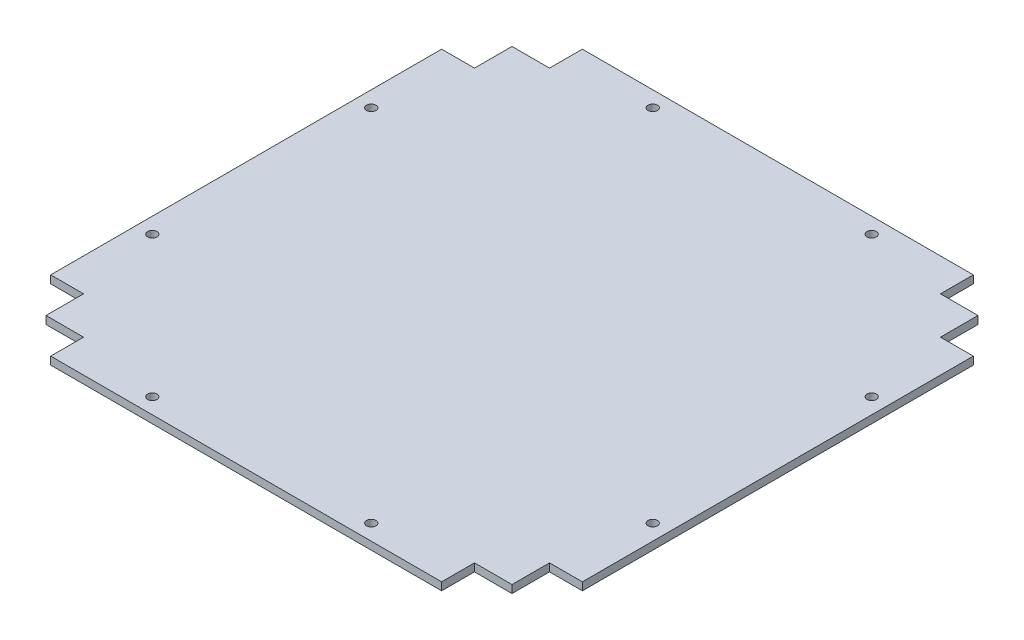
ISO-10303-21;
HEADER;
FILE_DESCRIPTION(('STEP AP214'),'2;1');
FILE_NAME('part.step','',(''),(''),'','','');
FILE_SCHEMA(('AUTOMOTIVE_DESIGN { 1 0 10303 214 1 1 1 1 }'));
ENDSEC;
DATA;
#1=APPLICATION_CONTEXT('core data for automotive mechanical design processes');
#2=APPLICATION_PROTOCOL_DEFINITION('international standard','automotive_design',2000,#1);
#3=PRODUCT_CONTEXT('',#1,'mechanical');
#4=PRODUCT('Part','Part','',(#3));
#5=PRODUCT_RELATED_PRODUCT_CATEGORY('part','',(#4));
#6=PRODUCT_DEFINITION_FORMATION('','',#4);
#7=PRODUCT_DEFINITION_CONTEXT('part definition',#1,'design');
#8=PRODUCT_DEFINITION('design','',#6,#7);
#9=PRODUCT_DEFINITION_SHAPE('','',#8);
#10=(LENGTH_UNIT() NAMED_UNIT(*) SI_UNIT(.MILLI.,.METRE.));
#11=(NAMED_UNIT(*) PLANE_ANGLE_UNIT() SI_UNIT($,.RADIAN.));
#12=(NAMED_UNIT(*) SI_UNIT($,.STERADIAN.) SOLID_ANGLE_UNIT());
#13=UNCERTAINTY_MEASURE_WITH_UNIT(LENGTH_MEASURE(1.E-05),#10,'distance_accuracy_value','');
#14=(GEOMETRIC_REPRESENTATION_CONTEXT(3) GLOBAL_UNCERTAINTY_ASSIGNED_CONTEXT((#13)) GLOBAL_UNIT_ASSIGNED_CONTEXT((#10,
#11,#12)) REPRESENTATION_CONTEXT('',''));
#15=CARTESIAN_POINT('',(0.,0.,0.));
#16=DIRECTION('',(0.,0.,1.));
#17=DIRECTION('',(1.,0.,0.));
#18=AXIS2_PLACEMENT_3D('',#15,#16,#17);
#19=CARTESIAN_POINT('',(0.,5.,0.));
#20=DIRECTION('',(0.,1.,0.));
#21=DIRECTION('',(0.,0.,1.));
#22=AXIS2_PLACEMENT_3D('',#19,#20,#21);
#23=PLANE('',#22);
#24=CARTESIAN_POINT('',(240.,5.,10.));
#25=DIRECTION('',(0.,1.,0.));
#26=DIRECTION('',(0.,0.,1.));
#27=AXIS2_PLACEMENT_3D('',#24,#25,#26);
#28=CIRCLE('',#27,2.99999999999999);
#29=CARTESIAN_POINT('',(240.,5.,13.));
#30=VERTEX_POINT('',#29);
#31=EDGE_CURVE('E371',#30,#30,#28,.F.);
#32=ORIENTED_EDGE('',*,*,#31,.T.);
#33=EDGE_LOOP('',(#32));
#34=FACE_BOUND('',#33,.T.);
#35=CARTESIAN_POINT('',(330.,5.,240.));
#36=DIRECTION('',(0.,1.,0.));
#37=DIRECTION('',(0.,0.,1.));
#38=AXIS2_PLACEMENT_3D('',#35,#36,#37);
#39=CIRCLE('',#38,2.99999999999997);
#40=CARTESIAN_POINT('',(330.,5.,243.));
#41=VERTEX_POINT('',#40);
#42=EDGE_CURVE('E366',#41,#41,#39,.F.);
#43=ORIENTED_EDGE('',*,*,#42,.T.);
#44=EDGE_LOOP('',(#43));
#45=FACE_BOUND('',#44,.T.);
#46=CARTESIAN_POINT('',(330.,5.,100.));
#47=DIRECTION('',(0.,1.,0.));
#48=DIRECTION('',(0.,0.,1.));
#49=AXIS2_PLACEMENT_3D('',#46,#47,#48);
#50=CIRCLE('',#49,3.00000000000002);
#51=CARTESIAN_POINT('',(330.,5.,103.));
#52=VERTEX_POINT('',#51);
#53=EDGE_CURVE('E361',#52,#52,#50,.F.);
#54=ORIENTED_EDGE('',*,*,#53,.T.);
#55=EDGE_LOOP('',(#54));
#56=FACE_BOUND('',#55,.T.);
#57=CARTESIAN_POINT('',(100.,5.,10.));
#58=DIRECTION('',(0.,1.,0.));
#59=DIRECTION('',(0.,0.,1.));
#60=AXIS2_PLACEMENT_3D('',#57,#58,#59);
#61=CIRCLE('',#60,3.00000000000001);
#62=CARTESIAN_POINT('',(100.,5.,13.));
#63=VERTEX_POINT('',#62);
#64=EDGE_CURVE('E351',#63,#63,#61,.F.);
#65=ORIENTED_EDGE('',*,*,#64,.T.);
#66=EDGE_LOOP('',(#65));
#67=FACE_BOUND('',#66,.T.);
#68=DIRECTION('',(0.,0.,1.));
#69=VECTOR('',#68,1.);
#70=CARTESIAN_POINT('',(45.,5.,319.));
#71=LINE('',#70,#69);
#72=CARTESIAN_POINT('',(45.,5.,319.));
#73=VERTEX_POINT('',#72);
#74=CARTESIAN_POINT('',(45.,5.,340.));
#75=VERTEX_POINT('',#74);
#76=EDGE_CURVE('E281',#73,#75,#71,.T.);
#77=ORIENTED_EDGE('',*,*,#76,.T.);
#78=DIRECTION('',(1.,0.,0.));
#79=VECTOR('',#78,1.);
#80=CARTESIAN_POINT('',(45.,5.,340.));
#81=LINE('',#80,#79);
#82=CARTESIAN_POINT('',(295.,5.,340.));
#83=VERTEX_POINT('',#82);
#84=EDGE_CURVE('E145',#75,#83,#81,.T.);
#85=ORIENTED_EDGE('',*,*,#84,.T.);
#86=DIRECTION('',(0.,0.,-1.));
#87=VECTOR('',#86,1.);
#88=CARTESIAN_POINT('',(295.,5.,319.));
#89=LINE('',#88,#87);
#90=CARTESIAN_POINT('',(295.,5.,319.));
#91=VERTEX_POINT('',#90);
#92=EDGE_CURVE('E400',#83,#91,#89,.T.);
#93=ORIENTED_EDGE('',*,*,#92,.T.);
#94=DIRECTION('',(1.,0.,0.));
#95=VECTOR('',#94,1.);
#96=CARTESIAN_POINT('',(319.,5.,319.));
#97=LINE('',#96,#95);
#98=CARTESIAN_POINT('',(319.,5.,319.));
#99=VERTEX_POINT('',#98);
#100=EDGE_CURVE('E403',#91,#99,#97,.T.);
#101=ORIENTED_EDGE('',*,*,#100,.T.);
#102=DIRECTION('',(0.,0.,-1.));
#103=VECTOR('',#102,1.);
#104=CARTESIAN_POINT('',(319.,5.,295.));
#105=LINE('',#104,#103);
#106=CARTESIAN_POINT('',(319.,5.,295.));
#107=VERTEX_POINT('',#106);
#108=EDGE_CURVE('E406',#99,#107,#105,.T.);
#109=ORIENTED_EDGE('',*,*,#108,.T.);
#110=DIRECTION('',(1.,0.,0.));
#111=VECTOR('',#110,1.);
#112=CARTESIAN_POINT('',(340.,5.,295.));
#113=LINE('',#112,#111);
#114=CARTESIAN_POINT('',(340.,5.,295.));
#115=VERTEX_POINT('',#114);
#116=EDGE_CURVE('E409',#107,#115,#113,.T.);
#117=ORIENTED_EDGE('',*,*,#116,.T.);
#118=DIRECTION('',(0.,0.,-1.));
#119=VECTOR('',#118,1.);
#120=CARTESIAN_POINT('',(340.,5.,45.0000000000002));
#121=LINE('',#120,#119);
#122=CARTESIAN_POINT('',(340.,5.,45.0000000000002));
#123=VERTEX_POINT('',#122);
#124=EDGE_CURVE('E412',#115,#123,#121,.T.);
#125=ORIENTED_EDGE('',*,*,#124,.T.);
#126=DIRECTION('',(-1.,0.,0.));
#127=VECTOR('',#126,1.);
#128=CARTESIAN_POINT('',(340.,5.,45.0000000000002));
#129=LINE('',#128,#127);
#130=CARTESIAN_POINT('',(319.,5.,45.0000000000002));
#131=VERTEX_POINT('',#130);
#132=EDGE_CURVE('E415',#123,#131,#129,.T.);
#133=ORIENTED_EDGE('',*,*,#132,.T.);
#134=DIRECTION('',(0.,0.,-1.));
#135=VECTOR('',#134,1.);
#136=CARTESIAN_POINT('',(319.,5.,45.0000000000002));
#137=LINE('',#136,#135);
#138=CARTESIAN_POINT('',(319.,5.,21.0000000000002));
#139=VERTEX_POINT('',#138);
#140=EDGE_CURVE('E418',#131,#139,#137,.T.);
#141=ORIENTED_EDGE('',*,*,#140,.T.);
#142=DIRECTION('',(-1.,0.,0.));
#143=VECTOR('',#142,1.);
#144=CARTESIAN_POINT('',(319.,5.,21.0000000000002));
#145=LINE('',#144,#143);
#146=CARTESIAN_POINT('',(295.,5.,21.0000000000002));
#147=VERTEX_POINT('',#146);
#148=EDGE_CURVE('E421',#139,#147,#145,.T.);
#149=ORIENTED_EDGE('',*,*,#148,.T.);
#150=DIRECTION('',(0.,0.,-1.));
#151=VECTOR('',#150,1.);
#152=CARTESIAN_POINT('',(295.,5.,21.0000000000002));
#153=LINE('',#152,#151);
#154=CARTESIAN_POINT('',(295.,5.,2.22044604925031E-13));
#155=VERTEX_POINT('',#154);
#156=EDGE_CURVE('E424',#147,#155,#153,.T.);
#157=ORIENTED_EDGE('',*,*,#156,.T.);
#158=DIRECTION('',(-1.,0.,0.));
#159=VECTOR('',#158,1.);
#160=CARTESIAN_POINT('',(45.,5.,0.));
#161=LINE('',#160,#159);
#162=CARTESIAN_POINT('',(45.,5.,0.));
#163=VERTEX_POINT('',#162);
#164=EDGE_CURVE('E427',#155,#163,#161,.T.);
#165=ORIENTED_EDGE('',*,*,#164,.T.);
#166=DIRECTION('',(0.,0.,1.));
#167=VECTOR('',#166,1.);
#168=CARTESIAN_POINT('',(45.,5.,21.));
#169=LINE('',#168,#167);
#170=CARTESIAN_POINT('',(45.,5.,21.));
#171=VERTEX_POINT('',#170);
#172=EDGE_CURVE('E430',#163,#171,#169,.T.);
#173=ORIENTED_EDGE('',*,*,#172,.T.);
#174=DIRECTION('',(-1.,0.,0.));
#175=VECTOR('',#174,1.);
#176=CARTESIAN_POINT('',(21.,5.,21.));
#177=LINE('',#176,#175);
#178=CARTESIAN_POINT('',(21.,5.,21.));
#179=VERTEX_POINT('',#178);
#180=EDGE_CURVE('E433',#171,#179,#177,.T.);
#181=ORIENTED_EDGE('',*,*,#180,.T.);
#182=DIRECTION('',(0.,0.,1.));
#183=VECTOR('',#182,1.);
#184=CARTESIAN_POINT('',(21.,5.,45.));
#185=LINE('',#184,#183);
#186=CARTESIAN_POINT('',(21.,5.,45.));
#187=VERTEX_POINT('',#186);
#188=EDGE_CURVE('E436',#179,#187,#185,.T.);
#189=ORIENTED_EDGE('',*,*,#188,.T.);
#190=DIRECTION('',(-1.,0.,0.));
#191=VECTOR('',#190,1.);
#192=CARTESIAN_POINT('',(0.,5.,45.));
#193=LINE('',#192,#191);
#194=CARTESIAN_POINT('',(0.,5.,45.));
#195=VERTEX_POINT('',#194);
#196=EDGE_CURVE('E439',#187,#195,#193,.T.);
#197=ORIENTED_EDGE('',*,*,#196,.T.);
#198=DIRECTION('',(0.,0.,1.));
#199=VECTOR('',#198,1.);
#200=CARTESIAN_POINT('',(0.,5.,45.));
#201=LINE('',#200,#199);
#202=CARTESIAN_POINT('',(0.,5.,295.));
#203=VERTEX_POINT('',#202);
#204=EDGE_CURVE('E200',#195,#203,#201,.T.);
#205=ORIENTED_EDGE('',*,*,#204,.T.);
#206=DIRECTION('',(1.,0.,0.));
#207=VECTOR('',#206,1.);
#208=CARTESIAN_POINT('',(0.,5.,295.));
#209=LINE('',#208,#207);
#210=CARTESIAN_POINT('',(21.,5.,295.));
#211=VERTEX_POINT('',#210);
#212=EDGE_CURVE('E194',#203,#211,#209,.T.);
#213=ORIENTED_EDGE('',*,*,#212,.T.);
#214=DIRECTION('',(0.,0.,1.));
#215=VECTOR('',#214,1.);
#216=CARTESIAN_POINT('',(21.,5.,295.));
#217=LINE('',#216,#215);
#218=CARTESIAN_POINT('',(21.,5.,319.));
#219=VERTEX_POINT('',#218);
#220=EDGE_CURVE('E198',#211,#219,#217,.T.);
#221=ORIENTED_EDGE('',*,*,#220,.T.);
#222=DIRECTION('',(1.,0.,0.));
#223=VECTOR('',#222,1.);
#224=CARTESIAN_POINT('',(21.,5.,319.));
#225=LINE('',#224,#223);
#226=EDGE_CURVE('E66',#219,#73,#225,.T.);
#227=ORIENTED_EDGE('',*,*,#226,.T.);
#228=EDGE_LOOP('',(#77,#85,#93,#101,#109,#117,#125,#133,#141,#149,#157,#165,#173,#181,#189,#197,
#205,#213,#221,#227));
#229=FACE_BOUND('',#228,.T.);
#230=CARTESIAN_POINT('',(240.,5.,330.));
#231=DIRECTION('',(0.,1.,0.));
#232=DIRECTION('',(0.,0.,1.));
#233=AXIS2_PLACEMENT_3D('',#230,#231,#232);
#234=CIRCLE('',#233,2.99999999999999);
#235=CARTESIAN_POINT('',(240.,5.,333.));
#236=VERTEX_POINT('',#235);
#237=EDGE_CURVE('E356',#236,#236,#234,.T.);
#238=ORIENTED_EDGE('',*,*,#237,.F.);
#239=EDGE_LOOP('',(#238));
#240=FACE_BOUND('',#239,.T.);
#241=CARTESIAN_POINT('',(100.,5.,330.));
#242=DIRECTION('',(0.,1.,0.));
#243=DIRECTION('',(0.,0.,1.));
#244=AXIS2_PLACEMENT_3D('',#241,#242,#243);
#245=CIRCLE('',#244,3.00000000000001);
#246=CARTESIAN_POINT('',(100.,5.,333.));
#247=VERTEX_POINT('',#246);
#248=EDGE_CURVE('E375',#247,#247,#245,.T.);
#249=ORIENTED_EDGE('',*,*,#248,.F.);
#250=EDGE_LOOP('',(#249));
#251=FACE_BOUND('',#250,.T.);
#252=CARTESIAN_POINT('',(10.0000000000001,5.,240.));
#253=DIRECTION('',(0.,1.,0.));
#254=DIRECTION('',(0.,0.,1.));
#255=AXIS2_PLACEMENT_3D('',#252,#253,#254);
#256=CIRCLE('',#255,2.99999999999998);
#257=CARTESIAN_POINT('',(10.0000000000001,5.,243.));
#258=VERTEX_POINT('',#257);
#259=EDGE_CURVE('E379',#258,#258,#256,.T.);
#260=ORIENTED_EDGE('',*,*,#259,.F.);
#261=EDGE_LOOP('',(#260));
#262=FACE_BOUND('',#261,.T.);
#263=CARTESIAN_POINT('',(10.,5.,100.));
#264=DIRECTION('',(0.,1.,0.));
#265=DIRECTION('',(0.,0.,1.));
#266=AXIS2_PLACEMENT_3D('',#263,#264,#265);
#267=CIRCLE('',#266,3.00000000000002);
#268=CARTESIAN_POINT('',(10.,5.,103.));
#269=VERTEX_POINT('',#268);
#270=EDGE_CURVE('E227',#269,#269,#267,.T.);
#271=ORIENTED_EDGE('',*,*,#270,.F.);
#272=EDGE_LOOP('',(#271));
#273=FACE_BOUND('',#272,.T.);
#274=ADVANCED_FACE('F46',(#34,#45,#56,#67,#229,#240,#251,#262,#273),#23,.T.);
#275=CARTESIAN_POINT('',(0.,0.,0.));
#276=DIRECTION('',(0.,1.,0.));
#277=DIRECTION('',(0.,0.,1.));
#278=AXIS2_PLACEMENT_3D('',#275,#276,#277);
#279=PLANE('',#278);
#280=CARTESIAN_POINT('',(10.0000000000001,0.,240.));
#281=DIRECTION('',(0.,1.,0.));
#282=DIRECTION('',(0.,0.,1.));
#283=AXIS2_PLACEMENT_3D('',#280,#281,#282);
#284=CIRCLE('',#283,2.99999999999998);
#285=CARTESIAN_POINT('',(10.0000000000001,0.,243.));
#286=VERTEX_POINT('',#285);
#287=EDGE_CURVE('E376',#286,#286,#284,.T.);
#288=ORIENTED_EDGE('',*,*,#287,.T.);
#289=EDGE_LOOP('',(#288));
#290=FACE_BOUND('',#289,.T.);
#291=CARTESIAN_POINT('',(240.,0.,330.));
#292=DIRECTION('',(0.,1.,0.));
#293=DIRECTION('',(0.,0.,1.));
#294=AXIS2_PLACEMENT_3D('',#291,#292,#293);
#295=CIRCLE('',#294,2.99999999999999);
#296=CARTESIAN_POINT('',(240.,0.,333.));
#297=VERTEX_POINT('',#296);
#298=EDGE_CURVE('E352',#297,#297,#295,.T.);
#299=ORIENTED_EDGE('',*,*,#298,.T.);
#300=EDGE_LOOP('',(#299));
#301=FACE_BOUND('',#300,.T.);
#302=CARTESIAN_POINT('',(100.,0.,10.));
#303=DIRECTION('',(0.,1.,0.));
#304=DIRECTION('',(0.,0.,1.));
#305=AXIS2_PLACEMENT_3D('',#302,#303,#304);
#306=CIRCLE('',#305,3.00000000000001);
#307=CARTESIAN_POINT('',(100.,0.,13.));
#308=VERTEX_POINT('',#307);
#309=EDGE_CURVE('E347',#308,#308,#306,.F.);
#310=ORIENTED_EDGE('',*,*,#309,.F.);
#311=EDGE_LOOP('',(#310));
#312=FACE_BOUND('',#311,.T.);
#313=DIRECTION('',(0.,0.,1.));
#314=VECTOR('',#313,1.);
#315=CARTESIAN_POINT('',(45.,0.,319.));
#316=LINE('',#315,#314);
#317=CARTESIAN_POINT('',(45.,0.,319.));
#318=VERTEX_POINT('',#317);
#319=CARTESIAN_POINT('',(45.,0.,340.));
#320=VERTEX_POINT('',#319);
#321=EDGE_CURVE('E222',#318,#320,#316,.T.);
#322=ORIENTED_EDGE('',*,*,#321,.F.);
#323=DIRECTION('',(1.,0.,0.));
#324=VECTOR('',#323,1.);
#325=CARTESIAN_POINT('',(21.,0.,319.));
#326=LINE('',#325,#324);
#327=CARTESIAN_POINT('',(21.,0.,319.));
#328=VERTEX_POINT('',#327);
#329=EDGE_CURVE('E137',#328,#318,#326,.T.);
#330=ORIENTED_EDGE('',*,*,#329,.F.);
#331=DIRECTION('',(0.,0.,1.));
#332=VECTOR('',#331,1.);
#333=CARTESIAN_POINT('',(21.,0.,295.));
#334=LINE('',#333,#332);
#335=CARTESIAN_POINT('',(21.,0.,295.));
#336=VERTEX_POINT('',#335);
#337=EDGE_CURVE('E131',#336,#328,#334,.T.);
#338=ORIENTED_EDGE('',*,*,#337,.F.);
#339=DIRECTION('',(1.,0.,0.));
#340=VECTOR('',#339,1.);
#341=CARTESIAN_POINT('',(0.,0.,295.));
#342=LINE('',#341,#340);
#343=CARTESIAN_POINT('',(0.,0.,295.));
#344=VERTEX_POINT('',#343);
#345=EDGE_CURVE('E209',#344,#336,#342,.T.);
#346=ORIENTED_EDGE('',*,*,#345,.F.);
#347=DIRECTION('',(0.,0.,1.));
#348=VECTOR('',#347,1.);
#349=CARTESIAN_POINT('',(0.,0.,45.));
#350=LINE('',#349,#348);
#351=CARTESIAN_POINT('',(0.,0.,45.));
#352=VERTEX_POINT('',#351);
#353=EDGE_CURVE('E272',#352,#344,#350,.T.);
#354=ORIENTED_EDGE('',*,*,#353,.F.);
#355=DIRECTION('',(-1.,0.,0.));
#356=VECTOR('',#355,1.);
#357=CARTESIAN_POINT('',(0.,0.,45.));
#358=LINE('',#357,#356);
#359=CARTESIAN_POINT('',(21.,0.,45.));
#360=VERTEX_POINT('',#359);
#361=EDGE_CURVE('E269',#360,#352,#358,.T.);
#362=ORIENTED_EDGE('',*,*,#361,.F.);
#363=DIRECTION('',(0.,0.,1.));
#364=VECTOR('',#363,1.);
#365=CARTESIAN_POINT('',(21.,0.,45.));
#366=LINE('',#365,#364);
#367=CARTESIAN_POINT('',(21.,0.,21.));
#368=VERTEX_POINT('',#367);
#369=EDGE_CURVE('E266',#368,#360,#366,.T.);
#370=ORIENTED_EDGE('',*,*,#369,.F.);
#371=DIRECTION('',(-1.,0.,0.));
#372=VECTOR('',#371,1.);
#373=CARTESIAN_POINT('',(21.,0.,21.));
#374=LINE('',#373,#372);
#375=CARTESIAN_POINT('',(45.,0.,21.));
#376=VERTEX_POINT('',#375);
#377=EDGE_CURVE('E263',#376,#368,#374,.T.);
#378=ORIENTED_EDGE('',*,*,#377,.F.);
#379=DIRECTION('',(0.,0.,1.));
#380=VECTOR('',#379,1.);
#381=CARTESIAN_POINT('',(45.,0.,21.));
#382=LINE('',#381,#380);
#383=CARTESIAN_POINT('',(45.,0.,0.));
#384=VERTEX_POINT('',#383);
#385=EDGE_CURVE('E260',#384,#376,#382,.T.);
#386=ORIENTED_EDGE('',*,*,#385,.F.);
#387=DIRECTION('',(-1.,0.,0.));
#388=VECTOR('',#387,1.);
#389=CARTESIAN_POINT('',(45.,0.,0.));
#390=LINE('',#389,#388);
#391=CARTESIAN_POINT('',(295.,0.,2.22044604925031E-13));
#392=VERTEX_POINT('',#391);
#393=EDGE_CURVE('E257',#392,#384,#390,.T.);
#394=ORIENTED_EDGE('',*,*,#393,.F.);
#395=DIRECTION('',(0.,0.,-1.));
#396=VECTOR('',#395,1.);
#397=CARTESIAN_POINT('',(295.,0.,21.0000000000002));
#398=LINE('',#397,#396);
#399=CARTESIAN_POINT('',(295.,0.,21.0000000000002));
#400=VERTEX_POINT('',#399);
#401=EDGE_CURVE('E254',#400,#392,#398,.T.);
#402=ORIENTED_EDGE('',*,*,#401,.F.);
#403=DIRECTION('',(-1.,0.,0.));
#404=VECTOR('',#403,1.);
#405=CARTESIAN_POINT('',(319.,0.,21.0000000000002));
#406=LINE('',#405,#404);
#407=CARTESIAN_POINT('',(319.,0.,21.0000000000002));
#408=VERTEX_POINT('',#407);
#409=EDGE_CURVE('E251',#408,#400,#406,.T.);
#410=ORIENTED_EDGE('',*,*,#409,.F.);
#411=DIRECTION('',(0.,0.,-1.));
#412=VECTOR('',#411,1.);
#413=CARTESIAN_POINT('',(319.,0.,45.0000000000002));
#414=LINE('',#413,#412);
#415=CARTESIAN_POINT('',(319.,0.,45.0000000000002));
#416=VERTEX_POINT('',#415);
#417=EDGE_CURVE('E248',#416,#408,#414,.T.);
#418=ORIENTED_EDGE('',*,*,#417,.F.);
#419=DIRECTION('',(-1.,0.,0.));
#420=VECTOR('',#419,1.);
#421=CARTESIAN_POINT('',(340.,0.,45.0000000000002));
#422=LINE('',#421,#420);
#423=CARTESIAN_POINT('',(340.,0.,45.0000000000002));
#424=VERTEX_POINT('',#423);
#425=EDGE_CURVE('E245',#424,#416,#422,.T.);
#426=ORIENTED_EDGE('',*,*,#425,.F.);
#427=DIRECTION('',(0.,0.,-1.));
#428=VECTOR('',#427,1.);
#429=CARTESIAN_POINT('',(340.,0.,45.0000000000002));
#430=LINE('',#429,#428);
#431=CARTESIAN_POINT('',(340.,0.,295.));
#432=VERTEX_POINT('',#431);
#433=EDGE_CURVE('E242',#432,#424,#430,.T.);
#434=ORIENTED_EDGE('',*,*,#433,.F.);
#435=DIRECTION('',(1.,0.,0.));
#436=VECTOR('',#435,1.);
#437=CARTESIAN_POINT('',(340.,0.,295.));
#438=LINE('',#437,#436);
#439=CARTESIAN_POINT('',(319.,0.,295.));
#440=VERTEX_POINT('',#439);
#441=EDGE_CURVE('E239',#440,#432,#438,.T.);
#442=ORIENTED_EDGE('',*,*,#441,.F.);
#443=DIRECTION('',(0.,0.,-1.));
#444=VECTOR('',#443,1.);
#445=CARTESIAN_POINT('',(319.,0.,295.));
#446=LINE('',#445,#444);
#447=CARTESIAN_POINT('',(319.,0.,319.));
#448=VERTEX_POINT('',#447);
#449=EDGE_CURVE('E236',#448,#440,#446,.T.);
#450=ORIENTED_EDGE('',*,*,#449,.F.);
#451=DIRECTION('',(1.,0.,0.));
#452=VECTOR('',#451,1.);
#453=CARTESIAN_POINT('',(319.,0.,319.));
#454=LINE('',#453,#452);
#455=CARTESIAN_POINT('',(295.,0.,319.));
#456=VERTEX_POINT('',#455);
#457=EDGE_CURVE('E233',#456,#448,#454,.T.);
#458=ORIENTED_EDGE('',*,*,#457,.F.);
#459=DIRECTION('',(0.,0.,-1.));
#460=VECTOR('',#459,1.);
#461=CARTESIAN_POINT('',(295.,0.,319.));
#462=LINE('',#461,#460);
#463=CARTESIAN_POINT('',(295.,0.,340.));
#464=VERTEX_POINT('',#463);
#465=EDGE_CURVE('E230',#464,#456,#462,.T.);
#466=ORIENTED_EDGE('',*,*,#465,.F.);
#467=DIRECTION('',(1.,0.,0.));
#468=VECTOR('',#467,1.);
#469=CARTESIAN_POINT('',(45.,0.,340.));
#470=LINE('',#469,#468);
#471=EDGE_CURVE('E226',#320,#464,#470,.T.);
#472=ORIENTED_EDGE('',*,*,#471,.F.);
#473=EDGE_LOOP('',(#322,#330,#338,#346,#354,#362,#370,#378,#386,#394,#402,#410,#418,#426,#434,
#442,#450,#458,#466,#472));
#474=FACE_BOUND('',#473,.T.);
#475=CARTESIAN_POINT('',(330.,0.,100.));
#476=DIRECTION('',(0.,1.,0.));
#477=DIRECTION('',(0.,0.,1.));
#478=AXIS2_PLACEMENT_3D('',#475,#476,#477);
#479=CIRCLE('',#478,3.00000000000002);
#480=CARTESIAN_POINT('',(330.,0.,103.));
#481=VERTEX_POINT('',#480);
#482=EDGE_CURVE('E357',#481,#481,#479,.F.);
#483=ORIENTED_EDGE('',*,*,#482,.F.);
#484=EDGE_LOOP('',(#483));
#485=FACE_BOUND('',#484,.T.);
#486=CARTESIAN_POINT('',(330.,0.,240.));
#487=DIRECTION('',(0.,1.,0.));
#488=DIRECTION('',(0.,0.,1.));
#489=AXIS2_PLACEMENT_3D('',#486,#487,#488);
#490=CIRCLE('',#489,2.99999999999997);
#491=CARTESIAN_POINT('',(330.,0.,243.));
#492=VERTEX_POINT('',#491);
#493=EDGE_CURVE('E362',#492,#492,#490,.F.);
#494=ORIENTED_EDGE('',*,*,#493,.F.);
#495=EDGE_LOOP('',(#494));
#496=FACE_BOUND('',#495,.T.);
#497=CARTESIAN_POINT('',(240.,0.,10.));
#498=DIRECTION('',(0.,1.,0.));
#499=DIRECTION('',(0.,0.,1.));
#500=AXIS2_PLACEMENT_3D('',#497,#498,#499);
#501=CIRCLE('',#500,2.99999999999999);
#502=CARTESIAN_POINT('',(240.,0.,13.));
#503=VERTEX_POINT('',#502);
#504=EDGE_CURVE('E367',#503,#503,#501,.F.);
#505=ORIENTED_EDGE('',*,*,#504,.F.);
#506=EDGE_LOOP('',(#505));
#507=FACE_BOUND('',#506,.T.);
#508=CARTESIAN_POINT('',(100.,0.,330.));
#509=DIRECTION('',(0.,1.,0.));
#510=DIRECTION('',(0.,0.,1.));
#511=AXIS2_PLACEMENT_3D('',#508,#509,#510);
#512=CIRCLE('',#511,3.00000000000001);
#513=CARTESIAN_POINT('',(100.,0.,333.));
#514=VERTEX_POINT('',#513);
#515=EDGE_CURVE('E372',#514,#514,#512,.T.);
#516=ORIENTED_EDGE('',*,*,#515,.T.);
#517=EDGE_LOOP('',(#516));
#518=FACE_BOUND('',#517,.T.);
#519=CARTESIAN_POINT('',(10.,0.,100.));
#520=DIRECTION('',(0.,1.,0.));
#521=DIRECTION('',(0.,0.,1.));
#522=AXIS2_PLACEMENT_3D('',#519,#520,#521);
#523=CIRCLE('',#522,3.00000000000002);
#524=CARTESIAN_POINT('',(10.,0.,103.));
#525=VERTEX_POINT('',#524);
#526=EDGE_CURVE('E50',#525,#525,#523,.T.);
#527=ORIENTED_EDGE('',*,*,#526,.T.);
#528=EDGE_LOOP('',(#527));
#529=FACE_BOUND('',#528,.T.);
#530=ADVANCED_FACE('F446',(#290,#301,#312,#474,#485,#496,#507,#518,#529),#279,.F.);
#531=CARTESIAN_POINT('',(45.,5.,319.));
#532=DIRECTION('',(1.,0.,0.));
#533=DIRECTION('',(0.,0.,-1.));
#534=AXIS2_PLACEMENT_3D('',#531,#532,#533);
#535=PLANE('',#534);
#536=ORIENTED_EDGE('',*,*,#321,.T.);
#537=DIRECTION('',(0.,-1.,0.));
#538=VECTOR('',#537,1.);
#539=CARTESIAN_POINT('',(45.,5.,340.));
#540=LINE('',#539,#538);
#541=EDGE_CURVE('E11',#75,#320,#540,.T.);
#542=ORIENTED_EDGE('',*,*,#541,.F.);
#543=ORIENTED_EDGE('',*,*,#76,.F.);
#544=DIRECTION('',(0.,-1.,0.));
#545=VECTOR('',#544,1.);
#546=CARTESIAN_POINT('',(45.,5.,319.));
#547=LINE('',#546,#545);
#548=EDGE_CURVE('E218',#73,#318,#547,.T.);
#549=ORIENTED_EDGE('',*,*,#548,.T.);
#550=EDGE_LOOP('',(#536,#542,#543,#549));
#551=FACE_BOUND('',#550,.T.);
#552=ADVANCED_FACE('F48',(#551),#535,.F.);
#553=CARTESIAN_POINT('',(45.,5.,340.));
#554=DIRECTION('',(0.,0.,-1.));
#555=DIRECTION('',(-1.,0.,0.));
#556=AXIS2_PLACEMENT_3D('',#553,#554,#555);
#557=PLANE('',#556);
#558=ORIENTED_EDGE('',*,*,#471,.T.);
#559=DIRECTION('',(0.,-1.,0.));
#560=VECTOR('',#559,1.);
#561=CARTESIAN_POINT('',(295.,5.,340.));
#562=LINE('',#561,#560);
#563=EDGE_CURVE('E57',#83,#464,#562,.T.);
#564=ORIENTED_EDGE('',*,*,#563,.F.);
#565=ORIENTED_EDGE('',*,*,#84,.F.);
#566=ORIENTED_EDGE('',*,*,#541,.T.);
#567=EDGE_LOOP('',(#558,#564,#565,#566));
#568=FACE_BOUND('',#567,.T.);
#569=ADVANCED_FACE('F536',(#568),#557,.F.);
#570=CARTESIAN_POINT('',(295.,5.,319.));
#571=DIRECTION('',(-1.,0.,0.));
#572=DIRECTION('',(0.,0.,1.));
#573=AXIS2_PLACEMENT_3D('',#570,#571,#572);
#574=PLANE('',#573);
#575=ORIENTED_EDGE('',*,*,#465,.T.);
#576=DIRECTION('',(0.,-1.,0.));
#577=VECTOR('',#576,1.);
#578=CARTESIAN_POINT('',(295.,5.,319.));
#579=LINE('',#578,#577);
#580=EDGE_CURVE('E340',#91,#456,#579,.T.);
#581=ORIENTED_EDGE('',*,*,#580,.F.);
#582=ORIENTED_EDGE('',*,*,#92,.F.);
#583=ORIENTED_EDGE('',*,*,#563,.T.);
#584=EDGE_LOOP('',(#575,#581,#582,#583));
#585=FACE_BOUND('',#584,.T.);
#586=ADVANCED_FACE('F533',(#585),#574,.F.);
#587=CARTESIAN_POINT('',(319.,5.,319.));
#588=DIRECTION('',(0.,0.,-1.));
#589=DIRECTION('',(-1.,0.,0.));
#590=AXIS2_PLACEMENT_3D('',#587,#588,#589);
#591=PLANE('',#590);
#592=ORIENTED_EDGE('',*,*,#457,.T.);
#593=DIRECTION('',(0.,-1.,0.));
#594=VECTOR('',#593,1.);
#595=CARTESIAN_POINT('',(319.,5.,319.));
#596=LINE('',#595,#594);
#597=EDGE_CURVE('E336',#99,#448,#596,.T.);
#598=ORIENTED_EDGE('',*,*,#597,.F.);
#599=ORIENTED_EDGE('',*,*,#100,.F.);
#600=ORIENTED_EDGE('',*,*,#580,.T.);
#601=EDGE_LOOP('',(#592,#598,#599,#600));
#602=FACE_BOUND('',#601,.T.);
#603=ADVANCED_FACE('F529',(#602),#591,.F.);
#604=CARTESIAN_POINT('',(319.,5.,295.));
#605=DIRECTION('',(-1.,0.,0.));
#606=DIRECTION('',(0.,0.,1.));
#607=AXIS2_PLACEMENT_3D('',#604,#605,#606);
#608=PLANE('',#607);
#609=ORIENTED_EDGE('',*,*,#449,.T.);
#610=DIRECTION('',(0.,-1.,0.));
#611=VECTOR('',#610,1.);
#612=CARTESIAN_POINT('',(319.,5.,295.));
#613=LINE('',#612,#611);
#614=EDGE_CURVE('E332',#107,#440,#613,.T.);
#615=ORIENTED_EDGE('',*,*,#614,.F.);
#616=ORIENTED_EDGE('',*,*,#108,.F.);
#617=ORIENTED_EDGE('',*,*,#597,.T.);
#618=EDGE_LOOP('',(#609,#615,#616,#617));
#619=FACE_BOUND('',#618,.T.);
#620=ADVANCED_FACE('F525',(#619),#608,.F.);
#621=CARTESIAN_POINT('',(340.,5.,295.));
#622=DIRECTION('',(0.,0.,-1.));
#623=DIRECTION('',(-1.,0.,0.));
#624=AXIS2_PLACEMENT_3D('',#621,#622,#623);
#625=PLANE('',#624);
#626=ORIENTED_EDGE('',*,*,#441,.T.);
#627=DIRECTION('',(0.,-1.,0.));
#628=VECTOR('',#627,1.);
#629=CARTESIAN_POINT('',(340.,5.,295.));
#630=LINE('',#629,#628);
#631=EDGE_CURVE('E328',#115,#432,#630,.T.);
#632=ORIENTED_EDGE('',*,*,#631,.F.);
#633=ORIENTED_EDGE('',*,*,#116,.F.);
#634=ORIENTED_EDGE('',*,*,#614,.T.);
#635=EDGE_LOOP('',(#626,#632,#633,#634));
#636=FACE_BOUND('',#635,.T.);
#637=ADVANCED_FACE('F521',(#636),#625,.F.);
#638=CARTESIAN_POINT('',(340.,5.,45.0000000000002));
#639=DIRECTION('',(-1.,0.,0.));
#640=DIRECTION('',(0.,0.,1.));
#641=AXIS2_PLACEMENT_3D('',#638,#639,#640);
#642=PLANE('',#641);
#643=ORIENTED_EDGE('',*,*,#433,.T.);
#644=DIRECTION('',(0.,-1.,0.));
#645=VECTOR('',#644,1.);
#646=CARTESIAN_POINT('',(340.,5.,45.0000000000002));
#647=LINE('',#646,#645);
#648=EDGE_CURVE('E324',#123,#424,#647,.T.);
#649=ORIENTED_EDGE('',*,*,#648,.F.);
#650=ORIENTED_EDGE('',*,*,#124,.F.);
#651=ORIENTED_EDGE('',*,*,#631,.T.);
#652=EDGE_LOOP('',(#643,#649,#650,#651));
#653=FACE_BOUND('',#652,.T.);
#654=ADVANCED_FACE('F517',(#653),#642,.F.);
#655=CARTESIAN_POINT('',(340.,5.,45.0000000000002));
#656=DIRECTION('',(0.,0.,1.));
#657=DIRECTION('',(1.,0.,0.));
#658=AXIS2_PLACEMENT_3D('',#655,#656,#657);
#659=PLANE('',#658);
#660=ORIENTED_EDGE('',*,*,#425,.T.);
#661=DIRECTION('',(0.,-1.,0.));
#662=VECTOR('',#661,1.);
#663=CARTESIAN_POINT('',(319.,5.,45.0000000000002));
#664=LINE('',#663,#662);
#665=EDGE_CURVE('E320',#131,#416,#664,.T.);
#666=ORIENTED_EDGE('',*,*,#665,.F.);
#667=ORIENTED_EDGE('',*,*,#132,.F.);
#668=ORIENTED_EDGE('',*,*,#648,.T.);
#669=EDGE_LOOP('',(#660,#666,#667,#668));
#670=FACE_BOUND('',#669,.T.);
#671=ADVANCED_FACE('F513',(#670),#659,.F.);
#672=CARTESIAN_POINT('',(319.,5.,45.0000000000002));
#673=DIRECTION('',(-1.,0.,0.));
#674=DIRECTION('',(0.,0.,1.));
#675=AXIS2_PLACEMENT_3D('',#672,#673,#674);
#676=PLANE('',#675);
#677=ORIENTED_EDGE('',*,*,#417,.T.);
#678=DIRECTION('',(0.,-1.,0.));
#679=VECTOR('',#678,1.);
#680=CARTESIAN_POINT('',(319.,5.,21.0000000000002));
#681=LINE('',#680,#679);
#682=EDGE_CURVE('E316',#139,#408,#681,.T.);
#683=ORIENTED_EDGE('',*,*,#682,.F.);
#684=ORIENTED_EDGE('',*,*,#140,.F.);
#685=ORIENTED_EDGE('',*,*,#665,.T.);
#686=EDGE_LOOP('',(#677,#683,#684,#685));
#687=FACE_BOUND('',#686,.T.);
#688=ADVANCED_FACE('F509',(#687),#676,.F.);
#689=CARTESIAN_POINT('',(319.,5.,21.0000000000002));
#690=DIRECTION('',(0.,0.,1.));
#691=DIRECTION('',(1.,0.,0.));
#692=AXIS2_PLACEMENT_3D('',#689,#690,#691);
#693=PLANE('',#692);
#694=ORIENTED_EDGE('',*,*,#409,.T.);
#695=DIRECTION('',(0.,-1.,0.));
#696=VECTOR('',#695,1.);
#697=CARTESIAN_POINT('',(295.,5.,21.0000000000002));
#698=LINE('',#697,#696);
#699=EDGE_CURVE('E312',#147,#400,#698,.T.);
#700=ORIENTED_EDGE('',*,*,#699,.F.);
#701=ORIENTED_EDGE('',*,*,#148,.F.);
#702=ORIENTED_EDGE('',*,*,#682,.T.);
#703=EDGE_LOOP('',(#694,#700,#701,#702));
#704=FACE_BOUND('',#703,.T.);
#705=ADVANCED_FACE('F505',(#704),#693,.F.);
#706=CARTESIAN_POINT('',(295.,5.,21.0000000000002));
#707=DIRECTION('',(-1.,0.,0.));
#708=DIRECTION('',(0.,0.,1.));
#709=AXIS2_PLACEMENT_3D('',#706,#707,#708);
#710=PLANE('',#709);
#711=ORIENTED_EDGE('',*,*,#401,.T.);
#712=DIRECTION('',(0.,-1.,0.));
#713=VECTOR('',#712,1.);
#714=CARTESIAN_POINT('',(295.,5.,2.22044604925031E-13));
#715=LINE('',#714,#713);
#716=EDGE_CURVE('E308',#155,#392,#715,.T.);
#717=ORIENTED_EDGE('',*,*,#716,.F.);
#718=ORIENTED_EDGE('',*,*,#156,.F.);
#719=ORIENTED_EDGE('',*,*,#699,.T.);
#720=EDGE_LOOP('',(#711,#717,#718,#719));
#721=FACE_BOUND('',#720,.T.);
#722=ADVANCED_FACE('F501',(#721),#710,.F.);
#723=CARTESIAN_POINT('',(45.,5.,0.));
#724=DIRECTION('',(0.,0.,1.));
#725=DIRECTION('',(1.,0.,0.));
#726=AXIS2_PLACEMENT_3D('',#723,#724,#725);
#727=PLANE('',#726);
#728=ORIENTED_EDGE('',*,*,#393,.T.);
#729=DIRECTION('',(0.,-1.,0.));
#730=VECTOR('',#729,1.);
#731=CARTESIAN_POINT('',(45.,5.,0.));
#732=LINE('',#731,#730);
#733=EDGE_CURVE('E304',#163,#384,#732,.T.);
#734=ORIENTED_EDGE('',*,*,#733,.F.);
#735=ORIENTED_EDGE('',*,*,#164,.F.);
#736=ORIENTED_EDGE('',*,*,#716,.T.);
#737=EDGE_LOOP('',(#728,#734,#735,#736));
#738=FACE_BOUND('',#737,.T.);
#739=ADVANCED_FACE('F497',(#738),#727,.F.);
#740=CARTESIAN_POINT('',(45.,5.,21.));
#741=DIRECTION('',(1.,0.,0.));
#742=DIRECTION('',(0.,0.,-1.));
#743=AXIS2_PLACEMENT_3D('',#740,#741,#742);
#744=PLANE('',#743);
#745=ORIENTED_EDGE('',*,*,#385,.T.);
#746=DIRECTION('',(0.,-1.,0.));
#747=VECTOR('',#746,1.);
#748=CARTESIAN_POINT('',(45.,5.,21.));
#749=LINE('',#748,#747);
#750=EDGE_CURVE('E300',#171,#376,#749,.T.);
#751=ORIENTED_EDGE('',*,*,#750,.F.);
#752=ORIENTED_EDGE('',*,*,#172,.F.);
#753=ORIENTED_EDGE('',*,*,#733,.T.);
#754=EDGE_LOOP('',(#745,#751,#752,#753));
#755=FACE_BOUND('',#754,.T.);
#756=ADVANCED_FACE('F493',(#755),#744,.F.);
#757=CARTESIAN_POINT('',(21.,5.,21.));
#758=DIRECTION('',(0.,0.,1.));
#759=DIRECTION('',(1.,0.,0.));
#760=AXIS2_PLACEMENT_3D('',#757,#758,#759);
#761=PLANE('',#760);
#762=ORIENTED_EDGE('',*,*,#377,.T.);
#763=DIRECTION('',(0.,-1.,0.));
#764=VECTOR('',#763,1.);
#765=CARTESIAN_POINT('',(21.,5.,21.));
#766=LINE('',#765,#764);
#767=EDGE_CURVE('E296',#179,#368,#766,.T.);
#768=ORIENTED_EDGE('',*,*,#767,.F.);
#769=ORIENTED_EDGE('',*,*,#180,.F.);
#770=ORIENTED_EDGE('',*,*,#750,.T.);
#771=EDGE_LOOP('',(#762,#768,#769,#770));
#772=FACE_BOUND('',#771,.T.);
#773=ADVANCED_FACE('F489',(#772),#761,.F.);
#774=CARTESIAN_POINT('',(21.,5.,45.));
#775=DIRECTION('',(1.,0.,0.));
#776=DIRECTION('',(0.,0.,-1.));
#777=AXIS2_PLACEMENT_3D('',#774,#775,#776);
#778=PLANE('',#777);
#779=ORIENTED_EDGE('',*,*,#369,.T.);
#780=DIRECTION('',(0.,-1.,0.));
#781=VECTOR('',#780,1.);
#782=CARTESIAN_POINT('',(21.,5.,45.));
#783=LINE('',#782,#781);
#784=EDGE_CURVE('E292',#187,#360,#783,.T.);
#785=ORIENTED_EDGE('',*,*,#784,.F.);
#786=ORIENTED_EDGE('',*,*,#188,.F.);
#787=ORIENTED_EDGE('',*,*,#767,.T.);
#788=EDGE_LOOP('',(#779,#785,#786,#787));
#789=FACE_BOUND('',#788,.T.);
#790=ADVANCED_FACE('F485',(#789),#778,.F.);
#791=CARTESIAN_POINT('',(0.,5.,45.));
#792=DIRECTION('',(0.,0.,1.));
#793=DIRECTION('',(1.,0.,0.));
#794=AXIS2_PLACEMENT_3D('',#791,#792,#793);
#795=PLANE('',#794);
#796=ORIENTED_EDGE('',*,*,#361,.T.);
#797=DIRECTION('',(0.,-1.,0.));
#798=VECTOR('',#797,1.);
#799=CARTESIAN_POINT('',(0.,5.,45.));
#800=LINE('',#799,#798);
#801=EDGE_CURVE('E288',#195,#352,#800,.T.);
#802=ORIENTED_EDGE('',*,*,#801,.F.);
#803=ORIENTED_EDGE('',*,*,#196,.F.);
#804=ORIENTED_EDGE('',*,*,#784,.T.);
#805=EDGE_LOOP('',(#796,#802,#803,#804));
#806=FACE_BOUND('',#805,.T.);
#807=ADVANCED_FACE('F481',(#806),#795,.F.);
#808=CARTESIAN_POINT('',(0.,5.,45.));
#809=DIRECTION('',(1.,0.,0.));
#810=DIRECTION('',(0.,0.,-1.));
#811=AXIS2_PLACEMENT_3D('',#808,#809,#810);
#812=PLANE('',#811);
#813=ORIENTED_EDGE('',*,*,#353,.T.);
#814=DIRECTION('',(0.,-1.,0.));
#815=VECTOR('',#814,1.);
#816=CARTESIAN_POINT('',(0.,5.,295.));
#817=LINE('',#816,#815);
#818=EDGE_CURVE('E211',#203,#344,#817,.T.);
#819=ORIENTED_EDGE('',*,*,#818,.F.);
#820=ORIENTED_EDGE('',*,*,#204,.F.);
#821=ORIENTED_EDGE('',*,*,#801,.T.);
#822=EDGE_LOOP('',(#813,#819,#820,#821));
#823=FACE_BOUND('',#822,.T.);
#824=ADVANCED_FACE('F478',(#823),#812,.F.);
#825=CARTESIAN_POINT('',(0.,5.,295.));
#826=DIRECTION('',(0.,0.,-1.));
#827=DIRECTION('',(-1.,0.,0.));
#828=AXIS2_PLACEMENT_3D('',#825,#826,#827);
#829=PLANE('',#828);
#830=ORIENTED_EDGE('',*,*,#345,.T.);
#831=DIRECTION('',(0.,-1.,0.));
#832=VECTOR('',#831,1.);
#833=CARTESIAN_POINT('',(21.,5.,295.));
#834=LINE('',#833,#832);
#835=EDGE_CURVE('E206',#211,#336,#834,.T.);
#836=ORIENTED_EDGE('',*,*,#835,.F.);
#837=ORIENTED_EDGE('',*,*,#212,.F.);
#838=ORIENTED_EDGE('',*,*,#818,.T.);
#839=EDGE_LOOP('',(#830,#836,#837,#838));
#840=FACE_BOUND('',#839,.T.);
#841=ADVANCED_FACE('F207',(#840),#829,.F.);
#842=CARTESIAN_POINT('',(21.,5.,295.));
#843=DIRECTION('',(1.,0.,0.));
#844=DIRECTION('',(0.,0.,-1.));
#845=AXIS2_PLACEMENT_3D('',#842,#843,#844);
#846=PLANE('',#845);
#847=ORIENTED_EDGE('',*,*,#337,.T.);
#848=DIRECTION('',(0.,-1.,0.));
#849=VECTOR('',#848,1.);
#850=CARTESIAN_POINT('',(21.,5.,319.));
#851=LINE('',#850,#849);
#852=EDGE_CURVE('E212',#219,#328,#851,.T.);
#853=ORIENTED_EDGE('',*,*,#852,.F.);
#854=ORIENTED_EDGE('',*,*,#220,.F.);
#855=ORIENTED_EDGE('',*,*,#835,.T.);
#856=EDGE_LOOP('',(#847,#853,#854,#855));
#857=FACE_BOUND('',#856,.T.);
#858=ADVANCED_FACE('F214',(#857),#846,.F.);
#859=CARTESIAN_POINT('',(21.,5.,319.));
#860=DIRECTION('',(0.,0.,-1.));
#861=DIRECTION('',(-1.,0.,0.));
#862=AXIS2_PLACEMENT_3D('',#859,#860,#861);
#863=PLANE('',#862);
#864=ORIENTED_EDGE('',*,*,#329,.T.);
#865=ORIENTED_EDGE('',*,*,#548,.F.);
#866=ORIENTED_EDGE('',*,*,#226,.F.);
#867=ORIENTED_EDGE('',*,*,#852,.T.);
#868=EDGE_LOOP('',(#864,#865,#866,#867));
#869=FACE_BOUND('',#868,.T.);
#870=ADVANCED_FACE('F471',(#869),#863,.F.);
#871=CARTESIAN_POINT('',(100.,62.,10.));
#872=DIRECTION('',(0.,-1.,0.));
#873=DIRECTION('',(0.,0.,-1.));
#874=AXIS2_PLACEMENT_3D('',#871,#872,#873);
#875=CYLINDRICAL_SURFACE('',#874,3.00000000000001);
#876=ORIENTED_EDGE('',*,*,#64,.F.);
#877=EDGE_LOOP('',(#876));
#878=FACE_BOUND('',#877,.T.);
#879=ORIENTED_EDGE('',*,*,#309,.T.);
#880=EDGE_LOOP('',(#879));
#881=FACE_BOUND('',#880,.T.);
#882=ADVANCED_FACE('F469',(#878,#881),#875,.F.);
#883=CARTESIAN_POINT('',(240.,62.,330.));
#884=DIRECTION('',(0.,-1.,0.));
#885=DIRECTION('',(0.,0.,-1.));
#886=AXIS2_PLACEMENT_3D('',#883,#884,#885);
#887=CYLINDRICAL_SURFACE('',#886,2.99999999999999);
#888=ORIENTED_EDGE('',*,*,#237,.T.);
#889=EDGE_LOOP('',(#888));
#890=FACE_BOUND('',#889,.T.);
#891=ORIENTED_EDGE('',*,*,#298,.F.);
#892=EDGE_LOOP('',(#891));
#893=FACE_BOUND('',#892,.T.);
#894=ADVANCED_FACE('F613',(#890,#893),#887,.F.);
#895=CARTESIAN_POINT('',(330.,62.,100.));
#896=DIRECTION('',(0.,-1.,0.));
#897=DIRECTION('',(0.,0.,-1.));
#898=AXIS2_PLACEMENT_3D('',#895,#896,#897);
#899=CYLINDRICAL_SURFACE('',#898,3.00000000000002);
#900=ORIENTED_EDGE('',*,*,#53,.F.);
#901=EDGE_LOOP('',(#900));
#902=FACE_BOUND('',#901,.T.);
#903=ORIENTED_EDGE('',*,*,#482,.T.);
#904=EDGE_LOOP('',(#903));
#905=FACE_BOUND('',#904,.T.);
#906=ADVANCED_FACE('F610',(#902,#905),#899,.F.);
#907=CARTESIAN_POINT('',(330.,62.,240.));
#908=DIRECTION('',(0.,-1.,0.));
#909=DIRECTION('',(0.,0.,-1.));
#910=AXIS2_PLACEMENT_3D('',#907,#908,#909);
#911=CYLINDRICAL_SURFACE('',#910,2.99999999999997);
#912=ORIENTED_EDGE('',*,*,#42,.F.);
#913=EDGE_LOOP('',(#912));
#914=FACE_BOUND('',#913,.T.);
#915=ORIENTED_EDGE('',*,*,#493,.T.);
#916=EDGE_LOOP('',(#915));
#917=FACE_BOUND('',#916,.T.);
#918=ADVANCED_FACE('F605',(#914,#917),#911,.F.);
#919=CARTESIAN_POINT('',(240.,62.,10.));
#920=DIRECTION('',(0.,-1.,0.));
#921=DIRECTION('',(0.,0.,-1.));
#922=AXIS2_PLACEMENT_3D('',#919,#920,#921);
#923=CYLINDRICAL_SURFACE('',#922,2.99999999999999);
#924=ORIENTED_EDGE('',*,*,#31,.F.);
#925=EDGE_LOOP('',(#924));
#926=FACE_BOUND('',#925,.T.);
#927=ORIENTED_EDGE('',*,*,#504,.T.);
#928=EDGE_LOOP('',(#927));
#929=FACE_BOUND('',#928,.T.);
#930=ADVANCED_FACE('F600',(#926,#929),#923,.F.);
#931=CARTESIAN_POINT('',(100.,62.,330.));
#932=DIRECTION('',(0.,-1.,0.));
#933=DIRECTION('',(0.,0.,-1.));
#934=AXIS2_PLACEMENT_3D('',#931,#932,#933);
#935=CYLINDRICAL_SURFACE('',#934,3.00000000000001);
#936=ORIENTED_EDGE('',*,*,#248,.T.);
#937=EDGE_LOOP('',(#936));
#938=FACE_BOUND('',#937,.T.);
#939=ORIENTED_EDGE('',*,*,#515,.F.);
#940=EDGE_LOOP('',(#939));
#941=FACE_BOUND('',#940,.T.);
#942=ADVANCED_FACE('F456',(#938,#941),#935,.F.);
#943=CARTESIAN_POINT('',(10.0000000000001,62.,240.));
#944=DIRECTION('',(0.,-1.,0.));
#945=DIRECTION('',(0.,0.,-1.));
#946=AXIS2_PLACEMENT_3D('',#943,#944,#945);
#947=CYLINDRICAL_SURFACE('',#946,2.99999999999998);
#948=ORIENTED_EDGE('',*,*,#259,.T.);
#949=EDGE_LOOP('',(#948));
#950=FACE_BOUND('',#949,.T.);
#951=ORIENTED_EDGE('',*,*,#287,.F.);
#952=EDGE_LOOP('',(#951));
#953=FACE_BOUND('',#952,.T.);
#954=ADVANCED_FACE('F450',(#950,#953),#947,.F.);
#955=CARTESIAN_POINT('',(10.,62.,100.));
#956=DIRECTION('',(0.,-1.,0.));
#957=DIRECTION('',(0.,0.,-1.));
#958=AXIS2_PLACEMENT_3D('',#955,#956,#957);
#959=CYLINDRICAL_SURFACE('',#958,3.00000000000002);
#960=ORIENTED_EDGE('',*,*,#270,.T.);
#961=EDGE_LOOP('',(#960));
#962=FACE_BOUND('',#961,.T.);
#963=ORIENTED_EDGE('',*,*,#526,.F.);
#964=EDGE_LOOP('',(#963));
#965=FACE_BOUND('',#964,.T.);
#966=ADVANCED_FACE('F448',(#962,#965),#959,.F.);
#967=CLOSED_SHELL('',(#274,#530,#552,#569,#586,#603,#620,#637,#654,#671,#688,#705,#722,#739,
#756,#773,#790,#807,#824,#841,#858,#870,#882,#894,#906,#918,#930,#942,#954,#966));
#968=MANIFOLD_SOLID_BREP('B2',#967);
#969=ADVANCED_BREP_SHAPE_REPRESENTATION('',(#18,#968),#14);
#970=SHAPE_DEFINITION_REPRESENTATION(#9,#969);
ENDSEC;
END-ISO-10303-21;
